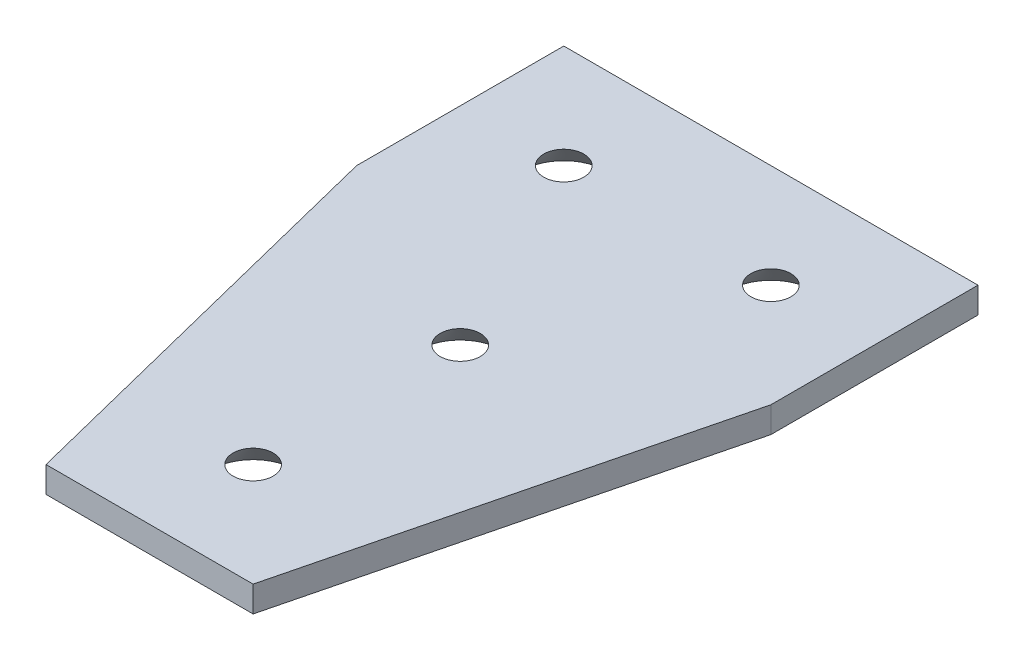
ISO-10303-21;
HEADER;
FILE_DESCRIPTION(('STEP AP214'),'2;1');
FILE_NAME('part.step','',(''),(''),'','','');
FILE_SCHEMA(('AUTOMOTIVE_DESIGN { 1 0 10303 214 1 1 1 1 }'));
ENDSEC;
DATA;
#1=APPLICATION_CONTEXT('core data for automotive mechanical design processes');
#2=APPLICATION_PROTOCOL_DEFINITION('international standard','automotive_design',2000,#1);
#3=PRODUCT_CONTEXT('',#1,'mechanical');
#4=PRODUCT('Part','Part','',(#3));
#5=PRODUCT_RELATED_PRODUCT_CATEGORY('part','',(#4));
#6=PRODUCT_DEFINITION_FORMATION('','',#4);
#7=PRODUCT_DEFINITION_CONTEXT('part definition',#1,'design');
#8=PRODUCT_DEFINITION('design','',#6,#7);
#9=PRODUCT_DEFINITION_SHAPE('','',#8);
#10=(LENGTH_UNIT() NAMED_UNIT(*) SI_UNIT(.MILLI.,.METRE.));
#11=(NAMED_UNIT(*) PLANE_ANGLE_UNIT() SI_UNIT($,.RADIAN.));
#12=(NAMED_UNIT(*) SI_UNIT($,.STERADIAN.) SOLID_ANGLE_UNIT());
#13=UNCERTAINTY_MEASURE_WITH_UNIT(LENGTH_MEASURE(1.E-05),#10,'distance_accuracy_value','');
#14=(GEOMETRIC_REPRESENTATION_CONTEXT(3) GLOBAL_UNCERTAINTY_ASSIGNED_CONTEXT((#13)) GLOBAL_UNIT_ASSIGNED_CONTEXT((#10,
#11,#12)) REPRESENTATION_CONTEXT('',''));
#15=CARTESIAN_POINT('',(0.,0.,0.));
#16=DIRECTION('',(0.,0.,1.));
#17=DIRECTION('',(1.,0.,0.));
#18=AXIS2_PLACEMENT_3D('',#15,#16,#17);
#19=CARTESIAN_POINT('',(0.,3.175,0.));
#20=DIRECTION('',(0.,1.,0.));
#21=DIRECTION('',(0.,0.,1.));
#22=AXIS2_PLACEMENT_3D('',#19,#20,#21);
#23=PLANE('',#22);
#24=CARTESIAN_POINT('',(37.7212712444665,3.175,-256.51115375047));
#25=DIRECTION('',(0.,1.,0.));
#26=DIRECTION('',(0.,0.,1.));
#27=AXIS2_PLACEMENT_3D('',#24,#25,#26);
#28=CIRCLE('',#27,2.45971460743348);
#29=CARTESIAN_POINT('',(37.7212712444665,3.175,-254.051439143036));
#30=VERTEX_POINT('',#29);
#31=EDGE_CURVE('E41',#30,#30,#28,.T.);
#32=ORIENTED_EDGE('',*,*,#31,.F.);
#33=EDGE_LOOP('',(#32));
#34=FACE_BOUND('',#33,.T.);
#35=DIRECTION('',(0.242535625036321,0.,0.970142500145335));
#36=VECTOR('',#35,1.);
#37=CARTESIAN_POINT('',(-0.378728755533506,3.175,-243.81115375047));
#38=LINE('',#37,#36);
#39=CARTESIAN_POINT('',(-0.378728755533506,3.175,-243.81115375047));
#40=VERTEX_POINT('',#39);
#41=CARTESIAN_POINT('',(12.3212712444665,3.175,-193.011153750467));
#42=VERTEX_POINT('',#41);
#43=EDGE_CURVE('E135',#40,#42,#38,.T.);
#44=ORIENTED_EDGE('',*,*,#43,.T.);
#45=DIRECTION('',(1.,0.,0.));
#46=VECTOR('',#45,1.);
#47=CARTESIAN_POINT('',(12.3212712444665,3.175,-193.011153750467));
#48=LINE('',#47,#46);
#49=CARTESIAN_POINT('',(37.7212712444665,3.175,-193.011153750467));
#50=VERTEX_POINT('',#49);
#51=EDGE_CURVE('E93',#42,#50,#48,.T.);
#52=ORIENTED_EDGE('',*,*,#51,.T.);
#53=DIRECTION('',(0.242535625036322,0.,-0.970142500145335));
#54=VECTOR('',#53,1.);
#55=CARTESIAN_POINT('',(37.7212712444665,3.175,-193.011153750467));
#56=LINE('',#55,#54);
#57=CARTESIAN_POINT('',(50.4212712444665,3.175,-243.81115375047));
#58=VERTEX_POINT('',#57);
#59=EDGE_CURVE('E106',#50,#58,#56,.T.);
#60=ORIENTED_EDGE('',*,*,#59,.T.);
#61=DIRECTION('',(0.,0.,-1.));
#62=VECTOR('',#61,1.);
#63=CARTESIAN_POINT('',(50.4212712444665,3.175,-269.21115375047));
#64=LINE('',#63,#62);
#65=CARTESIAN_POINT('',(50.4212712444665,3.175,-269.21115375047));
#66=VERTEX_POINT('',#65);
#67=EDGE_CURVE('E100',#58,#66,#64,.T.);
#68=ORIENTED_EDGE('',*,*,#67,.T.);
#69=DIRECTION('',(-1.,0.,0.));
#70=VECTOR('',#69,1.);
#71=CARTESIAN_POINT('',(-0.378728755533513,3.175,-269.21115375047));
#72=LINE('',#71,#70);
#73=CARTESIAN_POINT('',(-0.378728755533513,3.175,-269.21115375047));
#74=VERTEX_POINT('',#73);
#75=EDGE_CURVE('E104',#66,#74,#72,.T.);
#76=ORIENTED_EDGE('',*,*,#75,.T.);
#77=DIRECTION('',(0.,0.,1.));
#78=VECTOR('',#77,1.);
#79=CARTESIAN_POINT('',(-0.378728755533506,3.175,-243.81115375047));
#80=LINE('',#79,#78);
#81=EDGE_CURVE('E56',#74,#40,#80,.T.);
#82=ORIENTED_EDGE('',*,*,#81,.T.);
#83=EDGE_LOOP('',(#44,#52,#60,#68,#76,#82));
#84=FACE_BOUND('',#83,.T.);
#85=CARTESIAN_POINT('',(25.0212712444665,3.175,-205.71115375047));
#86=DIRECTION('',(0.,1.,0.));
#87=DIRECTION('',(0.,0.,1.));
#88=AXIS2_PLACEMENT_3D('',#85,#86,#87);
#89=CIRCLE('',#88,2.45971460743348);
#90=CARTESIAN_POINT('',(25.0212712444665,3.175,-203.251439143036));
#91=VERTEX_POINT('',#90);
#92=EDGE_CURVE('E128',#91,#91,#89,.T.);
#93=ORIENTED_EDGE('',*,*,#92,.F.);
#94=EDGE_LOOP('',(#93));
#95=FACE_BOUND('',#94,.T.);
#96=CARTESIAN_POINT('',(25.0212712444665,3.175,-231.11115375047));
#97=DIRECTION('',(0.,1.,0.));
#98=DIRECTION('',(0.,0.,1.));
#99=AXIS2_PLACEMENT_3D('',#96,#97,#98);
#100=CIRCLE('',#99,2.45971460743348);
#101=CARTESIAN_POINT('',(25.0212712444665,3.175,-228.651439143036));
#102=VERTEX_POINT('',#101);
#103=EDGE_CURVE('E147',#102,#102,#100,.T.);
#104=ORIENTED_EDGE('',*,*,#103,.F.);
#105=EDGE_LOOP('',(#104));
#106=FACE_BOUND('',#105,.T.);
#107=CARTESIAN_POINT('',(12.3212712444665,3.175,-256.51115375047));
#108=DIRECTION('',(0.,1.,0.));
#109=DIRECTION('',(0.,0.,1.));
#110=AXIS2_PLACEMENT_3D('',#107,#108,#109);
#111=CIRCLE('',#110,2.45971460743348);
#112=CARTESIAN_POINT('',(12.3212712444665,3.175,-254.051439143036));
#113=VERTEX_POINT('',#112);
#114=EDGE_CURVE('E140',#113,#113,#111,.T.);
#115=ORIENTED_EDGE('',*,*,#114,.F.);
#116=EDGE_LOOP('',(#115));
#117=FACE_BOUND('',#116,.T.);
#118=ADVANCED_FACE('F37',(#34,#84,#95,#106,#117),#23,.T.);
#119=CARTESIAN_POINT('',(0.,0.,0.));
#120=DIRECTION('',(0.,1.,0.));
#121=DIRECTION('',(0.,0.,1.));
#122=AXIS2_PLACEMENT_3D('',#119,#120,#121);
#123=PLANE('',#122);
#124=CARTESIAN_POINT('',(37.7212712444665,0.,-256.51115375047));
#125=DIRECTION('',(0.,-1.,0.));
#126=DIRECTION('',(0.,0.,-1.));
#127=AXIS2_PLACEMENT_3D('',#124,#125,#126);
#128=CIRCLE('',#127,5.2197);
#129=CARTESIAN_POINT('',(37.7212712444665,0.,-261.73085375047));
#130=VERTEX_POINT('',#129);
#131=EDGE_CURVE('E154',#130,#130,#128,.T.);
#132=ORIENTED_EDGE('',*,*,#131,.F.);
#133=EDGE_LOOP('',(#132));
#134=FACE_BOUND('',#133,.T.);
#135=CARTESIAN_POINT('',(12.3212712444665,0.,-256.51115375047));
#136=DIRECTION('',(0.,-1.,0.));
#137=DIRECTION('',(0.,0.,-1.));
#138=AXIS2_PLACEMENT_3D('',#135,#136,#137);
#139=CIRCLE('',#138,5.2197);
#140=CARTESIAN_POINT('',(12.3212712444665,0.,-261.73085375047));
#141=VERTEX_POINT('',#140);
#142=EDGE_CURVE('E143',#141,#141,#139,.T.);
#143=ORIENTED_EDGE('',*,*,#142,.F.);
#144=EDGE_LOOP('',(#143));
#145=FACE_BOUND('',#144,.T.);
#146=CARTESIAN_POINT('',(25.0212712444665,0.,-205.71115375047));
#147=DIRECTION('',(0.,-1.,0.));
#148=DIRECTION('',(0.,0.,-1.));
#149=AXIS2_PLACEMENT_3D('',#146,#147,#148);
#150=CIRCLE('',#149,5.2197);
#151=CARTESIAN_POINT('',(25.0212712444665,0.,-210.93085375047));
#152=VERTEX_POINT('',#151);
#153=EDGE_CURVE('E159',#152,#152,#150,.T.);
#154=ORIENTED_EDGE('',*,*,#153,.F.);
#155=EDGE_LOOP('',(#154));
#156=FACE_BOUND('',#155,.T.);
#157=DIRECTION('',(0.242535625036321,0.,0.970142500145335));
#158=VECTOR('',#157,1.);
#159=CARTESIAN_POINT('',(-0.378728755533506,0.,-243.81115375047));
#160=LINE('',#159,#158);
#161=CARTESIAN_POINT('',(-0.378728755533506,0.,-243.81115375047));
#162=VERTEX_POINT('',#161);
#163=CARTESIAN_POINT('',(12.3212712444665,0.,-193.011153750467));
#164=VERTEX_POINT('',#163);
#165=EDGE_CURVE('E124',#162,#164,#160,.T.);
#166=ORIENTED_EDGE('',*,*,#165,.F.);
#167=DIRECTION('',(0.,0.,1.));
#168=VECTOR('',#167,1.);
#169=CARTESIAN_POINT('',(-0.378728755533506,0.,-243.81115375047));
#170=LINE('',#169,#168);
#171=CARTESIAN_POINT('',(-0.378728755533513,0.,-269.21115375047));
#172=VERTEX_POINT('',#171);
#173=EDGE_CURVE('E85',#172,#162,#170,.T.);
#174=ORIENTED_EDGE('',*,*,#173,.F.);
#175=DIRECTION('',(-1.,0.,0.));
#176=VECTOR('',#175,1.);
#177=CARTESIAN_POINT('',(-0.378728755533513,0.,-269.21115375047));
#178=LINE('',#177,#176);
#179=CARTESIAN_POINT('',(50.4212712444665,0.,-269.21115375047));
#180=VERTEX_POINT('',#179);
#181=EDGE_CURVE('E79',#180,#172,#178,.T.);
#182=ORIENTED_EDGE('',*,*,#181,.F.);
#183=DIRECTION('',(0.,0.,-1.));
#184=VECTOR('',#183,1.);
#185=CARTESIAN_POINT('',(50.4212712444665,0.,-269.21115375047));
#186=LINE('',#185,#184);
#187=CARTESIAN_POINT('',(50.4212712444665,0.,-243.81115375047));
#188=VERTEX_POINT('',#187);
#189=EDGE_CURVE('E114',#188,#180,#186,.T.);
#190=ORIENTED_EDGE('',*,*,#189,.F.);
#191=DIRECTION('',(0.242535625036322,0.,-0.970142500145335));
#192=VECTOR('',#191,1.);
#193=CARTESIAN_POINT('',(37.7212712444665,0.,-193.011153750467));
#194=LINE('',#193,#192);
#195=CARTESIAN_POINT('',(37.7212712444665,0.,-193.011153750467));
#196=VERTEX_POINT('',#195);
#197=EDGE_CURVE('E130',#196,#188,#194,.T.);
#198=ORIENTED_EDGE('',*,*,#197,.F.);
#199=DIRECTION('',(1.,0.,0.));
#200=VECTOR('',#199,1.);
#201=CARTESIAN_POINT('',(12.3212712444665,0.,-193.011153750467));
#202=LINE('',#201,#200);
#203=EDGE_CURVE('E127',#164,#196,#202,.T.);
#204=ORIENTED_EDGE('',*,*,#203,.F.);
#205=EDGE_LOOP('',(#166,#174,#182,#190,#198,#204));
#206=FACE_BOUND('',#205,.T.);
#207=CARTESIAN_POINT('',(25.0212712444665,0.,-231.11115375047));
#208=DIRECTION('',(0.,-1.,0.));
#209=DIRECTION('',(0.,0.,-1.));
#210=AXIS2_PLACEMENT_3D('',#207,#208,#209);
#211=CIRCLE('',#210,5.2197);
#212=CARTESIAN_POINT('',(25.0212712444665,0.,-236.33085375047));
#213=VERTEX_POINT('',#212);
#214=EDGE_CURVE('E142',#213,#213,#211,.T.);
#215=ORIENTED_EDGE('',*,*,#214,.F.);
#216=EDGE_LOOP('',(#215));
#217=FACE_BOUND('',#216,.T.);
#218=ADVANCED_FACE('F173',(#134,#145,#156,#206,#217),#123,.F.);
#219=CARTESIAN_POINT('',(-0.378728755533506,3.175,-243.81115375047));
#220=DIRECTION('',(0.970142500145335,0.,-0.242535625036321));
#221=DIRECTION('',(-0.242535625036321,0.,-0.970142500145335));
#222=AXIS2_PLACEMENT_3D('',#219,#220,#221);
#223=PLANE('',#222);
#224=ORIENTED_EDGE('',*,*,#165,.T.);
#225=DIRECTION('',(0.,-1.,0.));
#226=VECTOR('',#225,1.);
#227=CARTESIAN_POINT('',(12.3212712444665,3.175,-193.011153750467));
#228=LINE('',#227,#226);
#229=EDGE_CURVE('E11',#42,#164,#228,.T.);
#230=ORIENTED_EDGE('',*,*,#229,.F.);
#231=ORIENTED_EDGE('',*,*,#43,.F.);
#232=DIRECTION('',(0.,-1.,0.));
#233=VECTOR('',#232,1.);
#234=CARTESIAN_POINT('',(-0.378728755533506,3.175,-243.81115375047));
#235=LINE('',#234,#233);
#236=EDGE_CURVE('E120',#40,#162,#235,.T.);
#237=ORIENTED_EDGE('',*,*,#236,.T.);
#238=EDGE_LOOP('',(#224,#230,#231,#237));
#239=FACE_BOUND('',#238,.T.);
#240=ADVANCED_FACE('F39',(#239),#223,.F.);
#241=CARTESIAN_POINT('',(12.3212712444665,3.175,-193.011153750467));
#242=DIRECTION('',(0.,0.,-1.));
#243=DIRECTION('',(-1.,0.,0.));
#244=AXIS2_PLACEMENT_3D('',#241,#242,#243);
#245=PLANE('',#244);
#246=ORIENTED_EDGE('',*,*,#203,.T.);
#247=DIRECTION('',(0.,-1.,0.));
#248=VECTOR('',#247,1.);
#249=CARTESIAN_POINT('',(37.7212712444665,3.175,-193.011153750467));
#250=LINE('',#249,#248);
#251=EDGE_CURVE('E47',#50,#196,#250,.T.);
#252=ORIENTED_EDGE('',*,*,#251,.F.);
#253=ORIENTED_EDGE('',*,*,#51,.F.);
#254=ORIENTED_EDGE('',*,*,#229,.T.);
#255=EDGE_LOOP('',(#246,#252,#253,#254));
#256=FACE_BOUND('',#255,.T.);
#257=ADVANCED_FACE('F167',(#256),#245,.F.);
#258=CARTESIAN_POINT('',(37.7212712444665,3.175,-193.011153750467));
#259=DIRECTION('',(-0.970142500145335,0.,-0.242535625036322));
#260=DIRECTION('',(-0.242535625036322,0.,0.970142500145335));
#261=AXIS2_PLACEMENT_3D('',#258,#259,#260);
#262=PLANE('',#261);
#263=ORIENTED_EDGE('',*,*,#197,.T.);
#264=DIRECTION('',(0.,-1.,0.));
#265=VECTOR('',#264,1.);
#266=CARTESIAN_POINT('',(50.4212712444665,3.175,-243.81115375047));
#267=LINE('',#266,#265);
#268=EDGE_CURVE('E115',#58,#188,#267,.T.);
#269=ORIENTED_EDGE('',*,*,#268,.F.);
#270=ORIENTED_EDGE('',*,*,#59,.F.);
#271=ORIENTED_EDGE('',*,*,#251,.T.);
#272=EDGE_LOOP('',(#263,#269,#270,#271));
#273=FACE_BOUND('',#272,.T.);
#274=ADVANCED_FACE('F170',(#273),#262,.F.);
#275=CARTESIAN_POINT('',(50.4212712444665,3.175,-269.21115375047));
#276=DIRECTION('',(-1.,0.,0.));
#277=DIRECTION('',(0.,0.,1.));
#278=AXIS2_PLACEMENT_3D('',#275,#276,#277);
#279=PLANE('',#278);
#280=ORIENTED_EDGE('',*,*,#189,.T.);
#281=DIRECTION('',(0.,-1.,0.));
#282=VECTOR('',#281,1.);
#283=CARTESIAN_POINT('',(50.4212712444665,3.175,-269.21115375047));
#284=LINE('',#283,#282);
#285=EDGE_CURVE('E111',#66,#180,#284,.T.);
#286=ORIENTED_EDGE('',*,*,#285,.F.);
#287=ORIENTED_EDGE('',*,*,#67,.F.);
#288=ORIENTED_EDGE('',*,*,#268,.T.);
#289=EDGE_LOOP('',(#280,#286,#287,#288));
#290=FACE_BOUND('',#289,.T.);
#291=ADVANCED_FACE('F112',(#290),#279,.F.);
#292=CARTESIAN_POINT('',(-0.378728755533513,3.175,-269.21115375047));
#293=DIRECTION('',(0.,0.,1.));
#294=DIRECTION('',(1.,0.,0.));
#295=AXIS2_PLACEMENT_3D('',#292,#293,#294);
#296=PLANE('',#295);
#297=ORIENTED_EDGE('',*,*,#181,.T.);
#298=DIRECTION('',(0.,-1.,0.));
#299=VECTOR('',#298,1.);
#300=CARTESIAN_POINT('',(-0.378728755533513,3.175,-269.21115375047));
#301=LINE('',#300,#299);
#302=EDGE_CURVE('E116',#74,#172,#301,.T.);
#303=ORIENTED_EDGE('',*,*,#302,.F.);
#304=ORIENTED_EDGE('',*,*,#75,.F.);
#305=ORIENTED_EDGE('',*,*,#285,.T.);
#306=EDGE_LOOP('',(#297,#303,#304,#305));
#307=FACE_BOUND('',#306,.T.);
#308=ADVANCED_FACE('F118',(#307),#296,.F.);
#309=CARTESIAN_POINT('',(-0.378728755533506,3.175,-243.81115375047));
#310=DIRECTION('',(1.,0.,0.));
#311=DIRECTION('',(0.,0.,-1.));
#312=AXIS2_PLACEMENT_3D('',#309,#310,#311);
#313=PLANE('',#312);
#314=ORIENTED_EDGE('',*,*,#173,.T.);
#315=ORIENTED_EDGE('',*,*,#236,.F.);
#316=ORIENTED_EDGE('',*,*,#81,.F.);
#317=ORIENTED_EDGE('',*,*,#302,.T.);
#318=EDGE_LOOP('',(#314,#315,#316,#317));
#319=FACE_BOUND('',#318,.T.);
#320=ADVANCED_FACE('F176',(#319),#313,.F.);
#321=CARTESIAN_POINT('',(25.0212712444665,0.,-205.71115375047));
#322=DIRECTION('',(0.,-1.,0.));
#323=DIRECTION('',(0.,0.,-1.));
#324=AXIS2_PLACEMENT_3D('',#321,#322,#323);
#325=CONICAL_SURFACE('',#324,5.2197,0.715584993317675);
#326=ORIENTED_EDGE('',*,*,#92,.T.);
#327=EDGE_LOOP('',(#326));
#328=FACE_BOUND('',#327,.T.);
#329=ORIENTED_EDGE('',*,*,#153,.T.);
#330=EDGE_LOOP('',(#329));
#331=FACE_BOUND('',#330,.T.);
#332=ADVANCED_FACE('F178',(#328,#331),#325,.F.);
#333=CARTESIAN_POINT('',(25.0212712444665,0.,-231.11115375047));
#334=DIRECTION('',(0.,-1.,0.));
#335=DIRECTION('',(0.,0.,-1.));
#336=AXIS2_PLACEMENT_3D('',#333,#334,#335);
#337=CONICAL_SURFACE('',#336,5.2197,0.715584993317675);
#338=ORIENTED_EDGE('',*,*,#103,.T.);
#339=EDGE_LOOP('',(#338));
#340=FACE_BOUND('',#339,.T.);
#341=ORIENTED_EDGE('',*,*,#214,.T.);
#342=EDGE_LOOP('',(#341));
#343=FACE_BOUND('',#342,.T.);
#344=ADVANCED_FACE('F184',(#340,#343),#337,.F.);
#345=CARTESIAN_POINT('',(12.3212712444665,0.,-256.51115375047));
#346=DIRECTION('',(0.,-1.,0.));
#347=DIRECTION('',(0.,0.,-1.));
#348=AXIS2_PLACEMENT_3D('',#345,#346,#347);
#349=CONICAL_SURFACE('',#348,5.2197,0.715584993317675);
#350=ORIENTED_EDGE('',*,*,#114,.T.);
#351=EDGE_LOOP('',(#350));
#352=FACE_BOUND('',#351,.T.);
#353=ORIENTED_EDGE('',*,*,#142,.T.);
#354=EDGE_LOOP('',(#353));
#355=FACE_BOUND('',#354,.T.);
#356=ADVANCED_FACE('F200',(#352,#355),#349,.F.);
#357=CARTESIAN_POINT('',(37.7212712444665,0.,-256.51115375047));
#358=DIRECTION('',(0.,-1.,0.));
#359=DIRECTION('',(0.,0.,-1.));
#360=AXIS2_PLACEMENT_3D('',#357,#358,#359);
#361=CONICAL_SURFACE('',#360,5.2197,0.715584993317675);
#362=ORIENTED_EDGE('',*,*,#31,.T.);
#363=EDGE_LOOP('',(#362));
#364=FACE_BOUND('',#363,.T.);
#365=ORIENTED_EDGE('',*,*,#131,.T.);
#366=EDGE_LOOP('',(#365));
#367=FACE_BOUND('',#366,.T.);
#368=ADVANCED_FACE('F204',(#364,#367),#361,.F.);
#369=CLOSED_SHELL('',(#118,#218,#240,#257,#274,#291,#308,#320,#332,#344,#356,#368));
#370=MANIFOLD_SOLID_BREP('B2',#369);
#371=ADVANCED_BREP_SHAPE_REPRESENTATION('',(#18,#370),#14);
#372=SHAPE_DEFINITION_REPRESENTATION(#9,#371);
ENDSEC;
END-ISO-10303-21;
